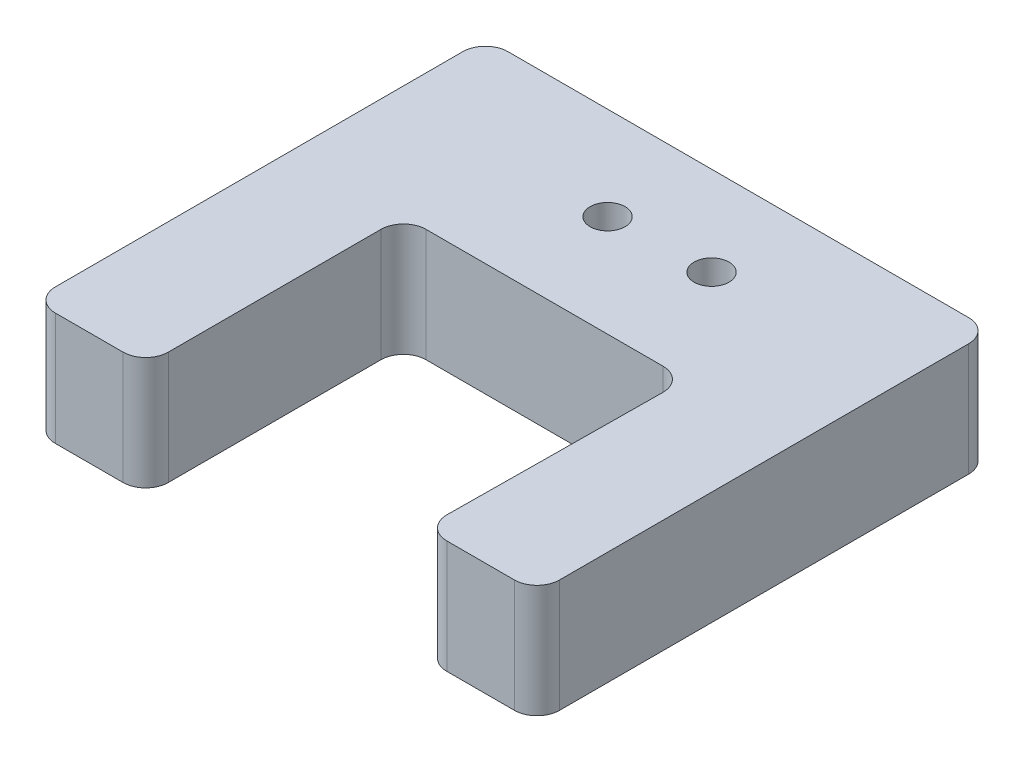
ISO-10303-21;
HEADER;
FILE_DESCRIPTION(('STEP AP214'),'2;1');
FILE_NAME('part.step','',(''),(''),'','','');
FILE_SCHEMA(('AUTOMOTIVE_DESIGN { 1 0 10303 214 1 1 1 1 }'));
ENDSEC;
DATA;
#1=APPLICATION_CONTEXT('core data for automotive mechanical design processes');
#2=APPLICATION_PROTOCOL_DEFINITION('international standard','automotive_design',2000,#1);
#3=PRODUCT_CONTEXT('',#1,'mechanical');
#4=PRODUCT('Part','Part','',(#3));
#5=PRODUCT_RELATED_PRODUCT_CATEGORY('part','',(#4));
#6=PRODUCT_DEFINITION_FORMATION('','',#4);
#7=PRODUCT_DEFINITION_CONTEXT('part definition',#1,'design');
#8=PRODUCT_DEFINITION('design','',#6,#7);
#9=PRODUCT_DEFINITION_SHAPE('','',#8);
#10=(LENGTH_UNIT() NAMED_UNIT(*) SI_UNIT(.MILLI.,.METRE.));
#11=(NAMED_UNIT(*) PLANE_ANGLE_UNIT() SI_UNIT($,.RADIAN.));
#12=(NAMED_UNIT(*) SI_UNIT($,.STERADIAN.) SOLID_ANGLE_UNIT());
#13=UNCERTAINTY_MEASURE_WITH_UNIT(LENGTH_MEASURE(1.E-05),#10,'distance_accuracy_value','');
#14=(GEOMETRIC_REPRESENTATION_CONTEXT(3) GLOBAL_UNCERTAINTY_ASSIGNED_CONTEXT((#13)) GLOBAL_UNIT_ASSIGNED_CONTEXT((#10,
#11,#12)) REPRESENTATION_CONTEXT('',''));
#15=CARTESIAN_POINT('',(0.,0.,0.));
#16=DIRECTION('',(0.,0.,1.));
#17=DIRECTION('',(1.,0.,0.));
#18=AXIS2_PLACEMENT_3D('',#15,#16,#17);
#19=CARTESIAN_POINT('',(3.77746310408145,10.,-24.0566526108548));
#20=DIRECTION('',(0.,-1.,0.));
#21=DIRECTION('',(0.,0.,-1.));
#22=AXIS2_PLACEMENT_3D('',#19,#20,#21);
#23=CYLINDRICAL_SURFACE('',#22,2.);
#24=CARTESIAN_POINT('',(3.77746310408145,0.,-24.0566526108548));
#25=DIRECTION('',(0.,1.,0.));
#26=DIRECTION('',(0.,0.,1.));
#27=AXIS2_PLACEMENT_3D('',#24,#25,#26);
#28=CIRCLE('',#27,2.);
#29=CARTESIAN_POINT('',(5.77746310408145,0.,-24.0566526108548));
#30=VERTEX_POINT('',#29);
#31=CARTESIAN_POINT('',(3.77746310408145,0.,-26.0566526108548));
#32=VERTEX_POINT('',#31);
#33=EDGE_CURVE('E188',#30,#32,#28,.T.);
#34=ORIENTED_EDGE('',*,*,#33,.T.);
#35=DIRECTION('',(0.,-1.,0.));
#36=VECTOR('',#35,1.);
#37=CARTESIAN_POINT('',(3.77746310408145,10.,-26.0566526108548));
#38=LINE('',#37,#36);
#39=CARTESIAN_POINT('',(3.77746310408145,10.,-26.0566526108548));
#40=VERTEX_POINT('',#39);
#41=EDGE_CURVE('E11',#40,#32,#38,.T.);
#42=ORIENTED_EDGE('',*,*,#41,.F.);
#43=CARTESIAN_POINT('',(3.77746310408145,10.,-24.0566526108548));
#44=DIRECTION('',(0.,1.,0.));
#45=DIRECTION('',(0.,0.,1.));
#46=AXIS2_PLACEMENT_3D('',#43,#44,#45);
#47=CIRCLE('',#46,2.);
#48=CARTESIAN_POINT('',(5.77746310408145,10.,-24.0566526108548));
#49=VERTEX_POINT('',#48);
#50=EDGE_CURVE('E235',#49,#40,#47,.T.);
#51=ORIENTED_EDGE('',*,*,#50,.F.);
#52=DIRECTION('',(0.,-1.,0.));
#53=VECTOR('',#52,1.);
#54=CARTESIAN_POINT('',(5.77746310408145,10.,-24.0566526108548));
#55=LINE('',#54,#53);
#56=EDGE_CURVE('E184',#49,#30,#55,.T.);
#57=ORIENTED_EDGE('',*,*,#56,.T.);
#58=EDGE_LOOP('',(#34,#42,#51,#57));
#59=FACE_BOUND('',#58,.T.);
#60=ADVANCED_FACE('F39',(#59),#23,.T.);
#61=CARTESIAN_POINT('',(-37.0074742804174,10.,-26.0566526108548));
#62=DIRECTION('',(0.,0.,1.));
#63=DIRECTION('',(1.,0.,0.));
#64=AXIS2_PLACEMENT_3D('',#61,#62,#63);
#65=PLANE('',#64);
#66=DIRECTION('',(-1.,0.,0.));
#67=VECTOR('',#66,1.);
#68=CARTESIAN_POINT('',(-37.0074742804174,0.,-26.0566526108548));
#69=LINE('',#68,#67);
#70=CARTESIAN_POINT('',(-37.0074742804174,0.,-26.0566526108548));
#71=VERTEX_POINT('',#70);
#72=EDGE_CURVE('E192',#32,#71,#69,.T.);
#73=ORIENTED_EDGE('',*,*,#72,.T.);
#74=DIRECTION('',(0.,-1.,0.));
#75=VECTOR('',#74,1.);
#76=CARTESIAN_POINT('',(-37.0074742804174,10.,-26.0566526108548));
#77=LINE('',#76,#75);
#78=CARTESIAN_POINT('',(-37.0074742804174,10.,-26.0566526108548));
#79=VERTEX_POINT('',#78);
#80=EDGE_CURVE('E48',#79,#71,#77,.T.);
#81=ORIENTED_EDGE('',*,*,#80,.F.);
#82=DIRECTION('',(-1.,0.,0.));
#83=VECTOR('',#82,1.);
#84=CARTESIAN_POINT('',(-37.0074742804174,10.,-26.0566526108548));
#85=LINE('',#84,#83);
#86=EDGE_CURVE('E123',#40,#79,#85,.T.);
#87=ORIENTED_EDGE('',*,*,#86,.F.);
#88=ORIENTED_EDGE('',*,*,#41,.T.);
#89=EDGE_LOOP('',(#73,#81,#87,#88));
#90=FACE_BOUND('',#89,.T.);
#91=ADVANCED_FACE('F358',(#90),#65,.F.);
#92=CARTESIAN_POINT('',(-37.0074742804174,10.,-24.0566526108548));
#93=DIRECTION('',(0.,-1.,0.));
#94=DIRECTION('',(0.,0.,-1.));
#95=AXIS2_PLACEMENT_3D('',#92,#93,#94);
#96=CYLINDRICAL_SURFACE('',#95,2.);
#97=CARTESIAN_POINT('',(-37.0074742804174,0.,-24.0566526108548));
#98=DIRECTION('',(0.,1.,0.));
#99=DIRECTION('',(0.,0.,1.));
#100=AXIS2_PLACEMENT_3D('',#97,#98,#99);
#101=CIRCLE('',#100,2.);
#102=CARTESIAN_POINT('',(-39.0074742804174,0.,-24.0566526108548));
#103=VERTEX_POINT('',#102);
#104=EDGE_CURVE('E196',#71,#103,#101,.T.);
#105=ORIENTED_EDGE('',*,*,#104,.T.);
#106=DIRECTION('',(0.,-1.,0.));
#107=VECTOR('',#106,1.);
#108=CARTESIAN_POINT('',(-39.0074742804174,10.,-24.0566526108548));
#109=LINE('',#108,#107);
#110=CARTESIAN_POINT('',(-39.0074742804174,10.,-24.0566526108548));
#111=VERTEX_POINT('',#110);
#112=EDGE_CURVE('E278',#111,#103,#109,.T.);
#113=ORIENTED_EDGE('',*,*,#112,.F.);
#114=CARTESIAN_POINT('',(-37.0074742804174,10.,-24.0566526108548));
#115=DIRECTION('',(0.,1.,0.));
#116=DIRECTION('',(0.,0.,1.));
#117=AXIS2_PLACEMENT_3D('',#114,#115,#116);
#118=CIRCLE('',#117,2.);
#119=EDGE_CURVE('E288',#79,#111,#118,.T.);
#120=ORIENTED_EDGE('',*,*,#119,.F.);
#121=ORIENTED_EDGE('',*,*,#80,.T.);
#122=EDGE_LOOP('',(#105,#113,#120,#121));
#123=FACE_BOUND('',#122,.T.);
#124=ADVANCED_FACE('F286',(#123),#96,.T.);
#125=CARTESIAN_POINT('',(-39.0074742804174,10.,12.0167324782077));
#126=DIRECTION('',(1.,0.,0.));
#127=DIRECTION('',(0.,0.,-1.));
#128=AXIS2_PLACEMENT_3D('',#125,#126,#127);
#129=PLANE('',#128);
#130=DIRECTION('',(0.,0.,1.));
#131=VECTOR('',#130,1.);
#132=CARTESIAN_POINT('',(-39.0074742804174,0.,12.0167324782077));
#133=LINE('',#132,#131);
#134=CARTESIAN_POINT('',(-39.0074742804174,0.,12.0167324782077));
#135=VERTEX_POINT('',#134);
#136=EDGE_CURVE('E199',#103,#135,#133,.T.);
#137=ORIENTED_EDGE('',*,*,#136,.T.);
#138=DIRECTION('',(0.,-1.,0.));
#139=VECTOR('',#138,1.);
#140=CARTESIAN_POINT('',(-39.0074742804174,10.,12.0167324782077));
#141=LINE('',#140,#139);
#142=CARTESIAN_POINT('',(-39.0074742804174,10.,12.0167324782077));
#143=VERTEX_POINT('',#142);
#144=EDGE_CURVE('E274',#143,#135,#141,.T.);
#145=ORIENTED_EDGE('',*,*,#144,.F.);
#146=DIRECTION('',(0.,0.,1.));
#147=VECTOR('',#146,1.);
#148=CARTESIAN_POINT('',(-39.0074742804174,10.,12.0167324782077));
#149=LINE('',#148,#147);
#150=EDGE_CURVE('E307',#111,#143,#149,.T.);
#151=ORIENTED_EDGE('',*,*,#150,.F.);
#152=ORIENTED_EDGE('',*,*,#112,.T.);
#153=EDGE_LOOP('',(#137,#145,#151,#152));
#154=FACE_BOUND('',#153,.T.);
#155=ADVANCED_FACE('F297',(#154),#129,.F.);
#156=CARTESIAN_POINT('',(-37.0074742804174,10.,12.0167324782077));
#157=DIRECTION('',(0.,-1.,0.));
#158=DIRECTION('',(0.,0.,-1.));
#159=AXIS2_PLACEMENT_3D('',#156,#157,#158);
#160=CYLINDRICAL_SURFACE('',#159,2.);
#161=CARTESIAN_POINT('',(-37.0074742804174,0.,12.0167324782077));
#162=DIRECTION('',(0.,1.,0.));
#163=DIRECTION('',(0.,0.,-1.));
#164=AXIS2_PLACEMENT_3D('',#161,#162,#163);
#165=CIRCLE('',#164,2.);
#166=CARTESIAN_POINT('',(-37.0074742804174,0.,14.0167324782077));
#167=VERTEX_POINT('',#166);
#168=EDGE_CURVE('E202',#135,#167,#165,.T.);
#169=ORIENTED_EDGE('',*,*,#168,.T.);
#170=DIRECTION('',(0.,-1.,0.));
#171=VECTOR('',#170,1.);
#172=CARTESIAN_POINT('',(-37.0074742804174,10.,14.0167324782077));
#173=LINE('',#172,#171);
#174=CARTESIAN_POINT('',(-37.0074742804174,10.,14.0167324782077));
#175=VERTEX_POINT('',#174);
#176=EDGE_CURVE('E270',#175,#167,#173,.T.);
#177=ORIENTED_EDGE('',*,*,#176,.F.);
#178=CARTESIAN_POINT('',(-37.0074742804174,10.,12.0167324782077));
#179=DIRECTION('',(0.,1.,0.));
#180=DIRECTION('',(0.,0.,-1.));
#181=AXIS2_PLACEMENT_3D('',#178,#179,#180);
#182=CIRCLE('',#181,2.);
#183=EDGE_CURVE('E303',#143,#175,#182,.T.);
#184=ORIENTED_EDGE('',*,*,#183,.F.);
#185=ORIENTED_EDGE('',*,*,#144,.T.);
#186=EDGE_LOOP('',(#169,#177,#184,#185));
#187=FACE_BOUND('',#186,.T.);
#188=ADVANCED_FACE('F301',(#187),#160,.T.);
#189=CARTESIAN_POINT('',(-31.0074742804174,10.,14.0167324782077));
#190=DIRECTION('',(0.,0.,-1.));
#191=DIRECTION('',(-1.,0.,0.));
#192=AXIS2_PLACEMENT_3D('',#189,#190,#191);
#193=PLANE('',#192);
#194=DIRECTION('',(1.,0.,0.));
#195=VECTOR('',#194,1.);
#196=CARTESIAN_POINT('',(-31.0074742804174,0.,14.0167324782077));
#197=LINE('',#196,#195);
#198=CARTESIAN_POINT('',(-31.0074742804174,0.,14.0167324782077));
#199=VERTEX_POINT('',#198);
#200=EDGE_CURVE('E205',#167,#199,#197,.T.);
#201=ORIENTED_EDGE('',*,*,#200,.T.);
#202=DIRECTION('',(0.,-1.,0.));
#203=VECTOR('',#202,1.);
#204=CARTESIAN_POINT('',(-31.0074742804174,10.,14.0167324782077));
#205=LINE('',#204,#203);
#206=CARTESIAN_POINT('',(-31.0074742804174,10.,14.0167324782077));
#207=VERTEX_POINT('',#206);
#208=EDGE_CURVE('E266',#207,#199,#205,.T.);
#209=ORIENTED_EDGE('',*,*,#208,.F.);
#210=DIRECTION('',(1.,0.,0.));
#211=VECTOR('',#210,1.);
#212=CARTESIAN_POINT('',(-31.0074742804174,10.,14.0167324782077));
#213=LINE('',#212,#211);
#214=EDGE_CURVE('E306',#175,#207,#213,.T.);
#215=ORIENTED_EDGE('',*,*,#214,.F.);
#216=ORIENTED_EDGE('',*,*,#176,.T.);
#217=EDGE_LOOP('',(#201,#209,#215,#216));
#218=FACE_BOUND('',#217,.T.);
#219=ADVANCED_FACE('F371',(#218),#193,.F.);
#220=CARTESIAN_POINT('',(-31.0074742804174,10.,12.0167324782077));
#221=DIRECTION('',(0.,-1.,0.));
#222=DIRECTION('',(0.,0.,-1.));
#223=AXIS2_PLACEMENT_3D('',#220,#221,#222);
#224=CYLINDRICAL_SURFACE('',#223,2.);
#225=CARTESIAN_POINT('',(-31.0074742804174,0.,12.0167324782077));
#226=DIRECTION('',(0.,1.,0.));
#227=DIRECTION('',(0.,0.,-1.));
#228=AXIS2_PLACEMENT_3D('',#225,#226,#227);
#229=CIRCLE('',#228,2.);
#230=CARTESIAN_POINT('',(-29.0074742804174,0.,12.0167324782077));
#231=VERTEX_POINT('',#230);
#232=EDGE_CURVE('E208',#199,#231,#229,.T.);
#233=ORIENTED_EDGE('',*,*,#232,.T.);
#234=DIRECTION('',(0.,-1.,0.));
#235=VECTOR('',#234,1.);
#236=CARTESIAN_POINT('',(-29.0074742804174,10.,12.0167324782077));
#237=LINE('',#236,#235);
#238=CARTESIAN_POINT('',(-29.0074742804174,10.,12.0167324782077));
#239=VERTEX_POINT('',#238);
#240=EDGE_CURVE('E262',#239,#231,#237,.T.);
#241=ORIENTED_EDGE('',*,*,#240,.F.);
#242=CARTESIAN_POINT('',(-31.0074742804174,10.,12.0167324782077));
#243=DIRECTION('',(0.,1.,0.));
#244=DIRECTION('',(0.,0.,-1.));
#245=AXIS2_PLACEMENT_3D('',#242,#243,#244);
#246=CIRCLE('',#245,2.);
#247=EDGE_CURVE('E311',#207,#239,#246,.T.);
#248=ORIENTED_EDGE('',*,*,#247,.F.);
#249=ORIENTED_EDGE('',*,*,#208,.T.);
#250=EDGE_LOOP('',(#233,#241,#248,#249));
#251=FACE_BOUND('',#250,.T.);
#252=ADVANCED_FACE('F374',(#251),#224,.T.);
#253=CARTESIAN_POINT('',(-29.0074742804174,10.,12.0167324782077));
#254=DIRECTION('',(-1.,0.,0.));
#255=DIRECTION('',(0.,0.,1.));
#256=AXIS2_PLACEMENT_3D('',#253,#254,#255);
#257=PLANE('',#256);
#258=DIRECTION('',(0.,0.,-1.));
#259=VECTOR('',#258,1.);
#260=CARTESIAN_POINT('',(-29.0074742804174,0.,12.0167324782077));
#261=LINE('',#260,#259);
#262=CARTESIAN_POINT('',(-29.0074742804174,0.,-6.80537202498743));
#263=VERTEX_POINT('',#262);
#264=EDGE_CURVE('E211',#231,#263,#261,.T.);
#265=ORIENTED_EDGE('',*,*,#264,.T.);
#266=DIRECTION('',(0.,-1.,0.));
#267=VECTOR('',#266,1.);
#268=CARTESIAN_POINT('',(-29.0074742804174,10.,-6.80537202498743));
#269=LINE('',#268,#267);
#270=CARTESIAN_POINT('',(-29.0074742804174,10.,-6.80537202498743));
#271=VERTEX_POINT('',#270);
#272=EDGE_CURVE('E258',#271,#263,#269,.T.);
#273=ORIENTED_EDGE('',*,*,#272,.F.);
#274=DIRECTION('',(0.,0.,-1.));
#275=VECTOR('',#274,1.);
#276=CARTESIAN_POINT('',(-29.0074742804174,10.,12.0167324782077));
#277=LINE('',#276,#275);
#278=EDGE_CURVE('E318',#239,#271,#277,.T.);
#279=ORIENTED_EDGE('',*,*,#278,.F.);
#280=ORIENTED_EDGE('',*,*,#240,.T.);
#281=EDGE_LOOP('',(#265,#273,#279,#280));
#282=FACE_BOUND('',#281,.T.);
#283=ADVANCED_FACE('F378',(#282),#257,.F.);
#284=CARTESIAN_POINT('',(-27.0074742804174,10.,-6.80537202498743));
#285=DIRECTION('',(0.,-1.,0.));
#286=DIRECTION('',(0.,0.,-1.));
#287=AXIS2_PLACEMENT_3D('',#284,#285,#286);
#288=CYLINDRICAL_SURFACE('',#287,2.);
#289=CARTESIAN_POINT('',(-27.0074742804174,0.,-6.80537202498743));
#290=DIRECTION('',(0.,-1.,0.));
#291=DIRECTION('',(0.,0.,1.));
#292=AXIS2_PLACEMENT_3D('',#289,#290,#291);
#293=CIRCLE('',#292,2.);
#294=CARTESIAN_POINT('',(-27.0074742804174,0.,-8.80537202498743));
#295=VERTEX_POINT('',#294);
#296=EDGE_CURVE('E214',#263,#295,#293,.T.);
#297=ORIENTED_EDGE('',*,*,#296,.T.);
#298=DIRECTION('',(0.,-1.,0.));
#299=VECTOR('',#298,1.);
#300=CARTESIAN_POINT('',(-27.0074742804174,10.,-8.80537202498743));
#301=LINE('',#300,#299);
#302=CARTESIAN_POINT('',(-27.0074742804174,10.,-8.80537202498743));
#303=VERTEX_POINT('',#302);
#304=EDGE_CURVE('E254',#303,#295,#301,.T.);
#305=ORIENTED_EDGE('',*,*,#304,.F.);
#306=CARTESIAN_POINT('',(-27.0074742804174,10.,-6.80537202498743));
#307=DIRECTION('',(0.,-1.,0.));
#308=DIRECTION('',(0.,0.,1.));
#309=AXIS2_PLACEMENT_3D('',#306,#307,#308);
#310=CIRCLE('',#309,2.);
#311=EDGE_CURVE('E321',#271,#303,#310,.T.);
#312=ORIENTED_EDGE('',*,*,#311,.F.);
#313=ORIENTED_EDGE('',*,*,#272,.T.);
#314=EDGE_LOOP('',(#297,#305,#312,#313));
#315=FACE_BOUND('',#314,.T.);
#316=ADVANCED_FACE('F382',(#315),#288,.F.);
#317=CARTESIAN_POINT('',(-6.02629072703544,10.,-8.80537202498743));
#318=DIRECTION('',(0.,0.,-1.));
#319=DIRECTION('',(-1.,0.,0.));
#320=AXIS2_PLACEMENT_3D('',#317,#318,#319);
#321=PLANE('',#320);
#322=DIRECTION('',(1.,0.,0.));
#323=VECTOR('',#322,1.);
#324=CARTESIAN_POINT('',(-6.02629072703544,0.,-8.80537202498743));
#325=LINE('',#324,#323);
#326=CARTESIAN_POINT('',(-6.02629072703544,0.,-8.80537202498743));
#327=VERTEX_POINT('',#326);
#328=EDGE_CURVE('E217',#295,#327,#325,.T.);
#329=ORIENTED_EDGE('',*,*,#328,.T.);
#330=DIRECTION('',(0.,-1.,0.));
#331=VECTOR('',#330,1.);
#332=CARTESIAN_POINT('',(-6.02629072703544,10.,-8.80537202498743));
#333=LINE('',#332,#331);
#334=CARTESIAN_POINT('',(-6.02629072703544,10.,-8.80537202498743));
#335=VERTEX_POINT('',#334);
#336=EDGE_CURVE('E250',#335,#327,#333,.T.);
#337=ORIENTED_EDGE('',*,*,#336,.F.);
#338=DIRECTION('',(1.,0.,0.));
#339=VECTOR('',#338,1.);
#340=CARTESIAN_POINT('',(-6.02629072703544,10.,-8.80537202498743));
#341=LINE('',#340,#339);
#342=EDGE_CURVE('E324',#303,#335,#341,.T.);
#343=ORIENTED_EDGE('',*,*,#342,.F.);
#344=ORIENTED_EDGE('',*,*,#304,.T.);
#345=EDGE_LOOP('',(#329,#337,#343,#344));
#346=FACE_BOUND('',#345,.T.);
#347=ADVANCED_FACE('F386',(#346),#321,.F.);
#348=CARTESIAN_POINT('',(-6.02629072703544,10.,-6.80537202498743));
#349=DIRECTION('',(0.,-1.,0.));
#350=DIRECTION('',(0.,0.,-1.));
#351=AXIS2_PLACEMENT_3D('',#348,#349,#350);
#352=CYLINDRICAL_SURFACE('',#351,2.);
#353=CARTESIAN_POINT('',(-6.02629072703544,0.,-6.80537202498743));
#354=DIRECTION('',(0.,-1.,0.));
#355=DIRECTION('',(0.,0.,1.));
#356=AXIS2_PLACEMENT_3D('',#353,#354,#355);
#357=CIRCLE('',#356,2.);
#358=CARTESIAN_POINT('',(-4.02637841285278,0.,-6.78664408915448));
#359=VERTEX_POINT('',#358);
#360=EDGE_CURVE('E220',#327,#359,#357,.T.);
#361=ORIENTED_EDGE('',*,*,#360,.T.);
#362=DIRECTION('',(0.,-1.,0.));
#363=VECTOR('',#362,1.);
#364=CARTESIAN_POINT('',(-4.02637841285278,10.,-6.78664408915448));
#365=LINE('',#364,#363);
#366=CARTESIAN_POINT('',(-4.02637841285278,10.,-6.78664408915448));
#367=VERTEX_POINT('',#366);
#368=EDGE_CURVE('E246',#367,#359,#365,.T.);
#369=ORIENTED_EDGE('',*,*,#368,.F.);
#370=CARTESIAN_POINT('',(-6.02629072703544,10.,-6.80537202498743));
#371=DIRECTION('',(0.,-1.,0.));
#372=DIRECTION('',(0.,0.,1.));
#373=AXIS2_PLACEMENT_3D('',#370,#371,#372);
#374=CIRCLE('',#373,2.);
#375=EDGE_CURVE('E327',#335,#367,#374,.T.);
#376=ORIENTED_EDGE('',*,*,#375,.F.);
#377=ORIENTED_EDGE('',*,*,#336,.T.);
#378=EDGE_LOOP('',(#361,#369,#376,#377));
#379=FACE_BOUND('',#378,.T.);
#380=ADVANCED_FACE('F390',(#379),#352,.F.);
#381=CARTESIAN_POINT('',(-4.02637841285278,10.,-6.78664408915448));
#382=DIRECTION('',(0.999956157091329,0.,0.00936396791647582));
#383=DIRECTION('',(0.00936396791647582,0.,-0.999956157091329));
#384=AXIS2_PLACEMENT_3D('',#381,#382,#383);
#385=PLANE('',#384);
#386=DIRECTION('',(-0.00936396791647582,0.,0.999956157091329));
#387=VECTOR('',#386,1.);
#388=CARTESIAN_POINT('',(-4.02637841285278,0.,-6.78664408915448));
#389=LINE('',#388,#387);
#390=CARTESIAN_POINT('',(-4.20363276348317,0.,12.1419320086147));
#391=VERTEX_POINT('',#390);
#392=EDGE_CURVE('E223',#359,#391,#389,.T.);
#393=ORIENTED_EDGE('',*,*,#392,.T.);
#394=DIRECTION('',(0.,-1.,0.));
#395=VECTOR('',#394,1.);
#396=CARTESIAN_POINT('',(-4.20363276348317,10.,12.1419320086147));
#397=LINE('',#396,#395);
#398=CARTESIAN_POINT('',(-4.20363276348317,10.,12.1419320086147));
#399=VERTEX_POINT('',#398);
#400=EDGE_CURVE('E242',#399,#391,#397,.T.);
#401=ORIENTED_EDGE('',*,*,#400,.F.);
#402=DIRECTION('',(-0.00936396791647582,0.,0.999956157091329));
#403=VECTOR('',#402,1.);
#404=CARTESIAN_POINT('',(-4.02637841285278,10.,-6.78664408915448));
#405=LINE('',#404,#403);
#406=EDGE_CURVE('E330',#367,#399,#405,.T.);
#407=ORIENTED_EDGE('',*,*,#406,.F.);
#408=ORIENTED_EDGE('',*,*,#368,.T.);
#409=EDGE_LOOP('',(#393,#401,#407,#408));
#410=FACE_BOUND('',#409,.T.);
#411=ADVANCED_FACE('F338',(#410),#385,.F.);
#412=CARTESIAN_POINT('',(-2.20372044930051,10.,12.1606599444476));
#413=DIRECTION('',(0.,-1.,0.));
#414=DIRECTION('',(0.,0.,-1.));
#415=AXIS2_PLACEMENT_3D('',#412,#413,#414);
#416=CYLINDRICAL_SURFACE('',#415,2.);
#417=CARTESIAN_POINT('',(-2.20372044930051,0.,12.1606599444476));
#418=DIRECTION('',(0.,1.,0.));
#419=DIRECTION('',(0.,0.,-1.));
#420=AXIS2_PLACEMENT_3D('',#417,#418,#419);
#421=CIRCLE('',#420,2.);
#422=CARTESIAN_POINT('',(-2.20372044930051,0.,14.1606599444476));
#423=VERTEX_POINT('',#422);
#424=EDGE_CURVE('E226',#391,#423,#421,.T.);
#425=ORIENTED_EDGE('',*,*,#424,.T.);
#426=DIRECTION('',(0.,-1.,0.));
#427=VECTOR('',#426,1.);
#428=CARTESIAN_POINT('',(-2.20372044930051,10.,14.1606599444476));
#429=LINE('',#428,#427);
#430=CARTESIAN_POINT('',(-2.20372044930051,10.,14.1606599444476));
#431=VERTEX_POINT('',#430);
#432=EDGE_CURVE('E177',#431,#423,#429,.T.);
#433=ORIENTED_EDGE('',*,*,#432,.F.);
#434=CARTESIAN_POINT('',(-2.20372044930051,10.,12.1606599444476));
#435=DIRECTION('',(0.,1.,0.));
#436=DIRECTION('',(0.,0.,-1.));
#437=AXIS2_PLACEMENT_3D('',#434,#435,#436);
#438=CIRCLE('',#437,2.);
#439=EDGE_CURVE('E166',#399,#431,#438,.T.);
#440=ORIENTED_EDGE('',*,*,#439,.F.);
#441=ORIENTED_EDGE('',*,*,#400,.T.);
#442=EDGE_LOOP('',(#425,#433,#440,#441));
#443=FACE_BOUND('',#442,.T.);
#444=ADVANCED_FACE('F342',(#443),#416,.T.);
#445=CARTESIAN_POINT('',(-2.20372044930051,10.,14.1606599444476));
#446=DIRECTION('',(0.,0.,-1.));
#447=DIRECTION('',(-1.,0.,0.));
#448=AXIS2_PLACEMENT_3D('',#445,#446,#447);
#449=PLANE('',#448);
#450=DIRECTION('',(1.,0.,0.));
#451=VECTOR('',#450,1.);
#452=CARTESIAN_POINT('',(-2.20372044930051,0.,14.1606599444476));
#453=LINE('',#452,#451);
#454=CARTESIAN_POINT('',(3.77746310408145,0.,14.1606599444476));
#455=VERTEX_POINT('',#454);
#456=EDGE_CURVE('E175',#423,#455,#453,.T.);
#457=ORIENTED_EDGE('',*,*,#456,.T.);
#458=DIRECTION('',(0.,-1.,0.));
#459=VECTOR('',#458,1.);
#460=CARTESIAN_POINT('',(3.77746310408145,10.,14.1606599444476));
#461=LINE('',#460,#459);
#462=CARTESIAN_POINT('',(3.77746310408145,10.,14.1606599444476));
#463=VERTEX_POINT('',#462);
#464=EDGE_CURVE('E172',#463,#455,#461,.T.);
#465=ORIENTED_EDGE('',*,*,#464,.F.);
#466=DIRECTION('',(1.,0.,0.));
#467=VECTOR('',#466,1.);
#468=CARTESIAN_POINT('',(-2.20372044930051,10.,14.1606599444476));
#469=LINE('',#468,#467);
#470=EDGE_CURVE('E160',#431,#463,#469,.T.);
#471=ORIENTED_EDGE('',*,*,#470,.F.);
#472=ORIENTED_EDGE('',*,*,#432,.T.);
#473=EDGE_LOOP('',(#457,#465,#471,#472));
#474=FACE_BOUND('',#473,.T.);
#475=ADVANCED_FACE('F173',(#474),#449,.F.);
#476=CARTESIAN_POINT('',(3.77746310408145,10.,12.1606599444476));
#477=DIRECTION('',(0.,-1.,0.));
#478=DIRECTION('',(0.,0.,-1.));
#479=AXIS2_PLACEMENT_3D('',#476,#477,#478);
#480=CYLINDRICAL_SURFACE('',#479,2.);
#481=CARTESIAN_POINT('',(3.77746310408145,0.,12.1606599444476));
#482=DIRECTION('',(0.,1.,0.));
#483=DIRECTION('',(0.,0.,-1.));
#484=AXIS2_PLACEMENT_3D('',#481,#482,#483);
#485=CIRCLE('',#484,2.);
#486=CARTESIAN_POINT('',(5.77746310408145,0.,12.1606599444476));
#487=VERTEX_POINT('',#486);
#488=EDGE_CURVE('E109',#455,#487,#485,.T.);
#489=ORIENTED_EDGE('',*,*,#488,.T.);
#490=DIRECTION('',(0.,-1.,0.));
#491=VECTOR('',#490,1.);
#492=CARTESIAN_POINT('',(5.77746310408145,10.,12.1606599444476));
#493=LINE('',#492,#491);
#494=CARTESIAN_POINT('',(5.77746310408145,10.,12.1606599444476));
#495=VERTEX_POINT('',#494);
#496=EDGE_CURVE('E178',#495,#487,#493,.T.);
#497=ORIENTED_EDGE('',*,*,#496,.F.);
#498=CARTESIAN_POINT('',(3.77746310408145,10.,12.1606599444476));
#499=DIRECTION('',(0.,1.,0.));
#500=DIRECTION('',(0.,0.,-1.));
#501=AXIS2_PLACEMENT_3D('',#498,#499,#500);
#502=CIRCLE('',#501,2.);
#503=EDGE_CURVE('E164',#463,#495,#502,.T.);
#504=ORIENTED_EDGE('',*,*,#503,.F.);
#505=ORIENTED_EDGE('',*,*,#464,.T.);
#506=EDGE_LOOP('',(#489,#497,#504,#505));
#507=FACE_BOUND('',#506,.T.);
#508=ADVANCED_FACE('F180',(#507),#480,.T.);
#509=CARTESIAN_POINT('',(5.77746310408145,10.,12.1606599444476));
#510=DIRECTION('',(-1.,0.,0.));
#511=DIRECTION('',(0.,0.,1.));
#512=AXIS2_PLACEMENT_3D('',#509,#510,#511);
#513=PLANE('',#512);
#514=DIRECTION('',(0.,0.,-1.));
#515=VECTOR('',#514,1.);
#516=CARTESIAN_POINT('',(5.77746310408145,0.,12.1606599444476));
#517=LINE('',#516,#515);
#518=EDGE_CURVE('E115',#487,#30,#517,.T.);
#519=ORIENTED_EDGE('',*,*,#518,.T.);
#520=ORIENTED_EDGE('',*,*,#56,.F.);
#521=DIRECTION('',(0.,0.,-1.));
#522=VECTOR('',#521,1.);
#523=CARTESIAN_POINT('',(5.77746310408145,10.,12.1606599444476));
#524=LINE('',#523,#522);
#525=EDGE_CURVE('E56',#495,#49,#524,.T.);
#526=ORIENTED_EDGE('',*,*,#525,.F.);
#527=ORIENTED_EDGE('',*,*,#496,.T.);
#528=EDGE_LOOP('',(#519,#520,#526,#527));
#529=FACE_BOUND('',#528,.T.);
#530=ADVANCED_FACE('F346',(#529),#513,.F.);
#531=CARTESIAN_POINT('',(3.77746310408145,10.,-24.0566526108548));
#532=DIRECTION('',(0.,1.,0.));
#533=DIRECTION('',(0.,0.,1.));
#534=AXIS2_PLACEMENT_3D('',#531,#532,#533);
#535=PLANE('',#534);
#536=CARTESIAN_POINT('',(-19.943988939378,10.,-17.812586933454));
#537=DIRECTION('',(0.,-1.,0.));
#538=DIRECTION('',(0.,0.,-1.));
#539=AXIS2_PLACEMENT_3D('',#536,#537,#538);
#540=CIRCLE('',#539,1.54449818226857);
#541=CARTESIAN_POINT('',(-19.943988939378,10.,-19.3570851157226));
#542=VERTEX_POINT('',#541);
#543=EDGE_CURVE('E493',#542,#542,#540,.T.);
#544=ORIENTED_EDGE('',*,*,#543,.T.);
#545=EDGE_LOOP('',(#544));
#546=FACE_BOUND('',#545,.T.);
#547=CARTESIAN_POINT('',(-11.0922872371262,10.,-18.1628522981043));
#548=DIRECTION('',(0.,-1.,0.));
#549=DIRECTION('',(0.,0.,-1.));
#550=AXIS2_PLACEMENT_3D('',#547,#548,#549);
#551=CIRCLE('',#550,1.54449818226857);
#552=CARTESIAN_POINT('',(-11.0922872371262,10.,-19.7073504803729));
#553=VERTEX_POINT('',#552);
#554=EDGE_CURVE('E498',#553,#553,#551,.T.);
#555=ORIENTED_EDGE('',*,*,#554,.T.);
#556=EDGE_LOOP('',(#555));
#557=FACE_BOUND('',#556,.T.);
#558=ORIENTED_EDGE('',*,*,#50,.T.);
#559=ORIENTED_EDGE('',*,*,#86,.T.);
#560=ORIENTED_EDGE('',*,*,#119,.T.);
#561=ORIENTED_EDGE('',*,*,#150,.T.);
#562=ORIENTED_EDGE('',*,*,#183,.T.);
#563=ORIENTED_EDGE('',*,*,#214,.T.);
#564=ORIENTED_EDGE('',*,*,#247,.T.);
#565=ORIENTED_EDGE('',*,*,#278,.T.);
#566=ORIENTED_EDGE('',*,*,#311,.T.);
#567=ORIENTED_EDGE('',*,*,#342,.T.);
#568=ORIENTED_EDGE('',*,*,#375,.T.);
#569=ORIENTED_EDGE('',*,*,#406,.T.);
#570=ORIENTED_EDGE('',*,*,#439,.T.);
#571=ORIENTED_EDGE('',*,*,#470,.T.);
#572=ORIENTED_EDGE('',*,*,#503,.T.);
#573=ORIENTED_EDGE('',*,*,#525,.T.);
#574=EDGE_LOOP('',(#558,#559,#560,#561,#562,#563,#564,#565,#566,#567,#568,#569,#570,#571,#572,#573));
#575=FACE_BOUND('',#574,.T.);
#576=ADVANCED_FACE('F162',(#546,#557,#575),#535,.T.);
#577=CARTESIAN_POINT('',(3.77746310408145,0.,-24.0566526108548));
#578=DIRECTION('',(0.,1.,0.));
#579=DIRECTION('',(0.,0.,1.));
#580=AXIS2_PLACEMENT_3D('',#577,#578,#579);
#581=PLANE('',#580);
#582=CARTESIAN_POINT('',(-19.8480616490468,0.,-17.9025530627775));
#583=DIRECTION('',(0.,1.,0.));
#584=DIRECTION('',(0.,0.,1.));
#585=AXIS2_PLACEMENT_3D('',#582,#583,#584);
#586=CIRCLE('',#585,4.);
#587=CARTESIAN_POINT('',(-19.8480616490468,0.,-13.9025530627775));
#588=VERTEX_POINT('',#587);
#589=EDGE_CURVE('E514',#588,#588,#586,.T.);
#590=ORIENTED_EDGE('',*,*,#589,.T.);
#591=EDGE_LOOP('',(#590));
#592=FACE_BOUND('',#591,.T.);
#593=CARTESIAN_POINT('',(-10.8480616490468,0.,-18.2775010129498));
#594=DIRECTION('',(0.,1.,0.));
#595=DIRECTION('',(0.,0.,1.));
#596=AXIS2_PLACEMENT_3D('',#593,#594,#595);
#597=CIRCLE('',#596,4.);
#598=CARTESIAN_POINT('',(-10.8480616490468,0.,-14.2775010129498));
#599=VERTEX_POINT('',#598);
#600=EDGE_CURVE('E502',#599,#599,#597,.T.);
#601=ORIENTED_EDGE('',*,*,#600,.T.);
#602=EDGE_LOOP('',(#601));
#603=FACE_BOUND('',#602,.T.);
#604=ORIENTED_EDGE('',*,*,#33,.F.);
#605=ORIENTED_EDGE('',*,*,#518,.F.);
#606=ORIENTED_EDGE('',*,*,#488,.F.);
#607=ORIENTED_EDGE('',*,*,#456,.F.);
#608=ORIENTED_EDGE('',*,*,#424,.F.);
#609=ORIENTED_EDGE('',*,*,#392,.F.);
#610=ORIENTED_EDGE('',*,*,#360,.F.);
#611=ORIENTED_EDGE('',*,*,#328,.F.);
#612=ORIENTED_EDGE('',*,*,#296,.F.);
#613=ORIENTED_EDGE('',*,*,#264,.F.);
#614=ORIENTED_EDGE('',*,*,#232,.F.);
#615=ORIENTED_EDGE('',*,*,#200,.F.);
#616=ORIENTED_EDGE('',*,*,#168,.F.);
#617=ORIENTED_EDGE('',*,*,#136,.F.);
#618=ORIENTED_EDGE('',*,*,#104,.F.);
#619=ORIENTED_EDGE('',*,*,#72,.F.);
#620=EDGE_LOOP('',(#604,#605,#606,#607,#608,#609,#610,#611,#612,#613,#614,#615,#616,#617,#618,#619));
#621=FACE_BOUND('',#620,.T.);
#622=ADVANCED_FACE('F292',(#592,#603,#621),#581,.F.);
#623=CARTESIAN_POINT('',(-10.8480616490468,4.,-18.2775010129498));
#624=DIRECTION('',(0.,-1.,0.));
#625=DIRECTION('',(0.,0.,-1.));
#626=AXIS2_PLACEMENT_3D('',#623,#624,#625);
#627=CYLINDRICAL_SURFACE('',#626,4.);
#628=CARTESIAN_POINT('',(-10.8480616490468,4.,-18.2775010129498));
#629=DIRECTION('',(0.,1.,0.));
#630=DIRECTION('',(0.,0.,1.));
#631=AXIS2_PLACEMENT_3D('',#628,#629,#630);
#632=CIRCLE('',#631,4.);
#633=CARTESIAN_POINT('',(-10.8480616490468,4.,-14.2775010129498));
#634=VERTEX_POINT('',#633);
#635=EDGE_CURVE('E518',#634,#634,#632,.T.);
#636=ORIENTED_EDGE('',*,*,#635,.T.);
#637=EDGE_LOOP('',(#636));
#638=FACE_BOUND('',#637,.T.);
#639=ORIENTED_EDGE('',*,*,#600,.F.);
#640=EDGE_LOOP('',(#639));
#641=FACE_BOUND('',#640,.T.);
#642=ADVANCED_FACE('F422',(#638,#641),#627,.F.);
#643=CARTESIAN_POINT('',(-10.8480616490468,4.,-18.2775010129498));
#644=DIRECTION('',(0.,1.,0.));
#645=DIRECTION('',(0.,0.,1.));
#646=AXIS2_PLACEMENT_3D('',#643,#644,#645);
#647=PLANE('',#646);
#648=CARTESIAN_POINT('',(-11.0922872371262,4.,-18.1628522981043));
#649=DIRECTION('',(0.,-1.,0.));
#650=DIRECTION('',(0.,0.,-1.));
#651=AXIS2_PLACEMENT_3D('',#648,#649,#650);
#652=CIRCLE('',#651,1.54449818226857);
#653=CARTESIAN_POINT('',(-11.0922872371262,4.,-19.7073504803729));
#654=VERTEX_POINT('',#653);
#655=EDGE_CURVE('E505',#654,#654,#652,.T.);
#656=ORIENTED_EDGE('',*,*,#655,.F.);
#657=EDGE_LOOP('',(#656));
#658=FACE_BOUND('',#657,.T.);
#659=ORIENTED_EDGE('',*,*,#635,.F.);
#660=EDGE_LOOP('',(#659));
#661=FACE_BOUND('',#660,.T.);
#662=ADVANCED_FACE('F431',(#658,#661),#647,.F.);
#663=CARTESIAN_POINT('',(-19.8480616490468,4.,-17.9025530627775));
#664=DIRECTION('',(0.,-1.,0.));
#665=DIRECTION('',(0.,0.,-1.));
#666=AXIS2_PLACEMENT_3D('',#663,#664,#665);
#667=CYLINDRICAL_SURFACE('',#666,4.);
#668=CARTESIAN_POINT('',(-19.8480616490468,4.,-17.9025530627775));
#669=DIRECTION('',(0.,1.,0.));
#670=DIRECTION('',(0.,0.,1.));
#671=AXIS2_PLACEMENT_3D('',#668,#669,#670);
#672=CIRCLE('',#671,4.);
#673=CARTESIAN_POINT('',(-19.8480616490468,4.,-13.9025530627775));
#674=VERTEX_POINT('',#673);
#675=EDGE_CURVE('E193',#674,#674,#672,.T.);
#676=ORIENTED_EDGE('',*,*,#675,.T.);
#677=EDGE_LOOP('',(#676));
#678=FACE_BOUND('',#677,.T.);
#679=ORIENTED_EDGE('',*,*,#589,.F.);
#680=EDGE_LOOP('',(#679));
#681=FACE_BOUND('',#680,.T.);
#682=ADVANCED_FACE('F439',(#678,#681),#667,.F.);
#683=CARTESIAN_POINT('',(-19.8480616490468,4.,-17.9025530627775));
#684=DIRECTION('',(0.,1.,0.));
#685=DIRECTION('',(0.,0.,1.));
#686=AXIS2_PLACEMENT_3D('',#683,#684,#685);
#687=PLANE('',#686);
#688=CARTESIAN_POINT('',(-19.943988939378,4.,-17.812586933454));
#689=DIRECTION('',(0.,-1.,0.));
#690=DIRECTION('',(0.,0.,-1.));
#691=AXIS2_PLACEMENT_3D('',#688,#689,#690);
#692=CIRCLE('',#691,1.54449818226857);
#693=CARTESIAN_POINT('',(-19.943988939378,4.,-19.3570851157226));
#694=VERTEX_POINT('',#693);
#695=EDGE_CURVE('E496',#694,#694,#692,.T.);
#696=ORIENTED_EDGE('',*,*,#695,.F.);
#697=EDGE_LOOP('',(#696));
#698=FACE_BOUND('',#697,.T.);
#699=ORIENTED_EDGE('',*,*,#675,.F.);
#700=EDGE_LOOP('',(#699));
#701=FACE_BOUND('',#700,.T.);
#702=ADVANCED_FACE('F444',(#698,#701),#687,.F.);
#703=CARTESIAN_POINT('',(-11.0922872371262,10.,-18.1628522981043));
#704=DIRECTION('',(0.,-1.,0.));
#705=DIRECTION('',(0.,0.,-1.));
#706=AXIS2_PLACEMENT_3D('',#703,#704,#705);
#707=CYLINDRICAL_SURFACE('',#706,1.54449818226857);
#708=ORIENTED_EDGE('',*,*,#554,.F.);
#709=EDGE_LOOP('',(#708));
#710=FACE_BOUND('',#709,.T.);
#711=ORIENTED_EDGE('',*,*,#655,.T.);
#712=EDGE_LOOP('',(#711));
#713=FACE_BOUND('',#712,.T.);
#714=ADVANCED_FACE('F466',(#710,#713),#707,.F.);
#715=CARTESIAN_POINT('',(-19.943988939378,10.,-17.812586933454));
#716=DIRECTION('',(0.,-1.,0.));
#717=DIRECTION('',(0.,0.,-1.));
#718=AXIS2_PLACEMENT_3D('',#715,#716,#717);
#719=CYLINDRICAL_SURFACE('',#718,1.54449818226857);
#720=ORIENTED_EDGE('',*,*,#543,.F.);
#721=EDGE_LOOP('',(#720));
#722=FACE_BOUND('',#721,.T.);
#723=ORIENTED_EDGE('',*,*,#695,.T.);
#724=EDGE_LOOP('',(#723));
#725=FACE_BOUND('',#724,.T.);
#726=ADVANCED_FACE('F476',(#722,#725),#719,.F.);
#727=CLOSED_SHELL('',(#60,#91,#124,#155,#188,#219,#252,#283,#316,#347,#380,#411,#444,#475,#508,
#530,#576,#622,#642,#662,#682,#702,#714,#726));
#728=MANIFOLD_SOLID_BREP('B2',#727);
#729=ADVANCED_BREP_SHAPE_REPRESENTATION('',(#18,#728),#14);
#730=SHAPE_DEFINITION_REPRESENTATION(#9,#729);
ENDSEC;
END-ISO-10303-21;
